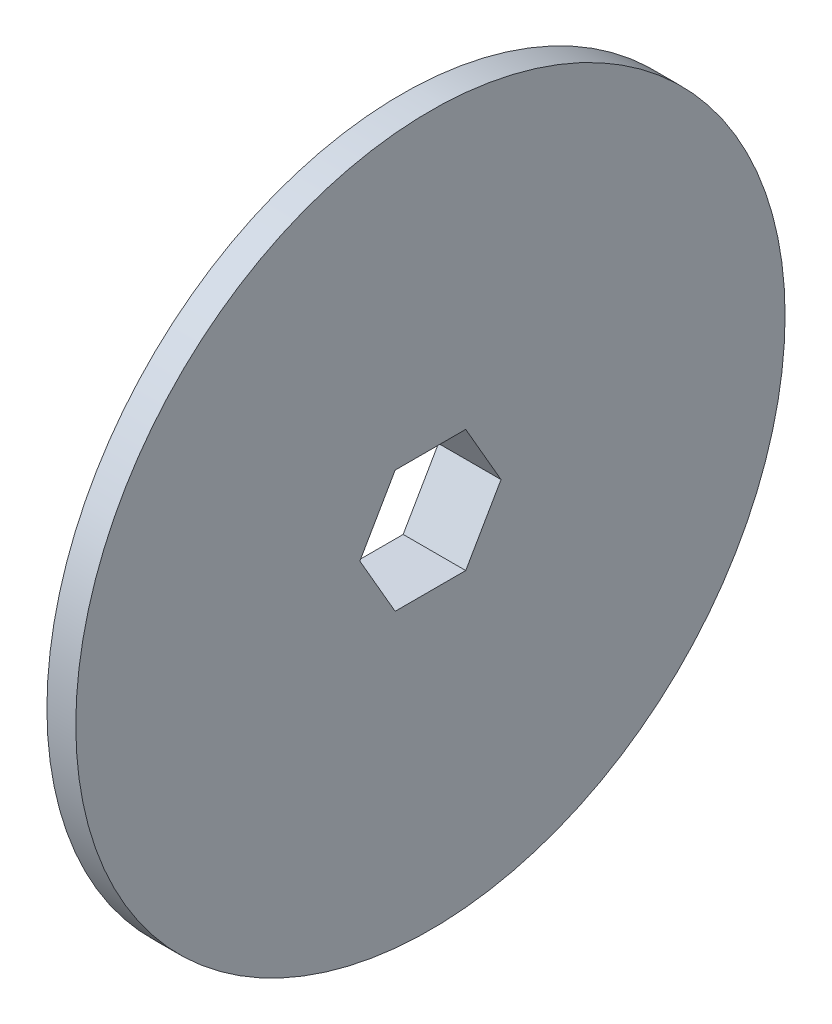
ISO-10303-21;
HEADER;
FILE_DESCRIPTION(('STEP AP214'),'2;1');
FILE_NAME('part.step','',(''),(''),'','','');
FILE_SCHEMA(('AUTOMOTIVE_DESIGN { 1 0 10303 214 1 1 1 1 }'));
ENDSEC;
DATA;
#1=APPLICATION_CONTEXT('core data for automotive mechanical design processes');
#2=APPLICATION_PROTOCOL_DEFINITION('international standard','automotive_design',2000,#1);
#3=PRODUCT_CONTEXT('',#1,'mechanical');
#4=PRODUCT('Part','Part','',(#3));
#5=PRODUCT_RELATED_PRODUCT_CATEGORY('part','',(#4));
#6=PRODUCT_DEFINITION_FORMATION('','',#4);
#7=PRODUCT_DEFINITION_CONTEXT('part definition',#1,'design');
#8=PRODUCT_DEFINITION('design','',#6,#7);
#9=PRODUCT_DEFINITION_SHAPE('','',#8);
#10=(LENGTH_UNIT() NAMED_UNIT(*) SI_UNIT(.MILLI.,.METRE.));
#11=(NAMED_UNIT(*) PLANE_ANGLE_UNIT() SI_UNIT($,.RADIAN.));
#12=(NAMED_UNIT(*) SI_UNIT($,.STERADIAN.) SOLID_ANGLE_UNIT());
#13=UNCERTAINTY_MEASURE_WITH_UNIT(LENGTH_MEASURE(1.E-05),#10,'distance_accuracy_value','');
#14=(GEOMETRIC_REPRESENTATION_CONTEXT(3) GLOBAL_UNCERTAINTY_ASSIGNED_CONTEXT((#13)) GLOBAL_UNIT_ASSIGNED_CONTEXT((#10,
#11,#12)) REPRESENTATION_CONTEXT('',''));
#15=CARTESIAN_POINT('',(0.,0.,0.));
#16=DIRECTION('',(0.,0.,1.));
#17=DIRECTION('',(1.,0.,0.));
#18=AXIS2_PLACEMENT_3D('',#15,#16,#17);
#19=CARTESIAN_POINT('',(0.,0.,0.));
#20=DIRECTION('',(1.,0.,0.));
#21=DIRECTION('',(0.,0.,-1.));
#22=AXIS2_PLACEMENT_3D('',#19,#20,#21);
#23=PLANE('',#22);
#24=CARTESIAN_POINT('',(0.,0.,0.));
#25=DIRECTION('',(1.,0.,0.));
#26=DIRECTION('',(0.,0.,-1.));
#27=AXIS2_PLACEMENT_3D('',#24,#25,#26);
#28=CIRCLE('',#27,14.345);
#29=CARTESIAN_POINT('',(0.,0.,-14.345));
#30=VERTEX_POINT('',#29);
#31=EDGE_CURVE('E51',#30,#30,#28,.T.);
#32=ORIENTED_EDGE('',*,*,#31,.F.);
#33=EDGE_LOOP('',(#32));
#34=FACE_BOUND('',#33,.T.);
#35=DIRECTION('',(0.,0.866025403784439,-0.5));
#36=VECTOR('',#35,1.);
#37=CARTESIAN_POINT('',(0.,-6.35,-3.66617420935412));
#38=LINE('',#37,#36);
#39=CARTESIAN_POINT('',(0.,-6.35,-3.66617420935412));
#40=VERTEX_POINT('',#39);
#41=CARTESIAN_POINT('',(0.,0.,-7.33234841870825));
#42=VERTEX_POINT('',#41);
#43=EDGE_CURVE('E63',#40,#42,#38,.T.);
#44=ORIENTED_EDGE('',*,*,#43,.T.);
#45=DIRECTION('',(0.,0.866025403784438,0.5));
#46=VECTOR('',#45,1.);
#47=CARTESIAN_POINT('',(0.,0.,-7.33234841870825));
#48=LINE('',#47,#46);
#49=CARTESIAN_POINT('',(0.,6.35,-3.66617420935412));
#50=VERTEX_POINT('',#49);
#51=EDGE_CURVE('E109',#42,#50,#48,.T.);
#52=ORIENTED_EDGE('',*,*,#51,.T.);
#53=DIRECTION('',(0.,0.,1.));
#54=VECTOR('',#53,1.);
#55=CARTESIAN_POINT('',(0.,6.35,-3.66617420935412));
#56=LINE('',#55,#54);
#57=CARTESIAN_POINT('',(0.,6.35,3.66617420935412));
#58=VERTEX_POINT('',#57);
#59=EDGE_CURVE('E153',#50,#58,#56,.T.);
#60=ORIENTED_EDGE('',*,*,#59,.T.);
#61=DIRECTION('',(0.,-0.866025403784439,0.5));
#62=VECTOR('',#61,1.);
#63=CARTESIAN_POINT('',(0.,6.35,3.66617420935412));
#64=LINE('',#63,#62);
#65=CARTESIAN_POINT('',(0.,0.,7.33234841870825));
#66=VERTEX_POINT('',#65);
#67=EDGE_CURVE('E157',#58,#66,#64,.T.);
#68=ORIENTED_EDGE('',*,*,#67,.T.);
#69=DIRECTION('',(0.,-0.866025403784438,-0.5));
#70=VECTOR('',#69,1.);
#71=CARTESIAN_POINT('',(0.,0.,7.33234841870825));
#72=LINE('',#71,#70);
#73=CARTESIAN_POINT('',(0.,-6.35,3.66617420935412));
#74=VERTEX_POINT('',#73);
#75=EDGE_CURVE('E161',#66,#74,#72,.T.);
#76=ORIENTED_EDGE('',*,*,#75,.T.);
#77=DIRECTION('',(0.,0.,-1.));
#78=VECTOR('',#77,1.);
#79=CARTESIAN_POINT('',(0.,-6.35,3.66617420935412));
#80=LINE('',#79,#78);
#81=EDGE_CURVE('E165',#74,#40,#80,.T.);
#82=ORIENTED_EDGE('',*,*,#81,.T.);
#83=EDGE_LOOP('',(#44,#52,#60,#68,#76,#82));
#84=FACE_BOUND('',#83,.T.);
#85=ADVANCED_FACE('F47',(#34,#84),#23,.F.);
#86=CARTESIAN_POINT('',(3.5,0.,0.));
#87=DIRECTION('',(-1.,0.,0.));
#88=DIRECTION('',(0.,0.,1.));
#89=AXIS2_PLACEMENT_3D('',#86,#87,#88);
#90=CYLINDRICAL_SURFACE('',#89,14.345);
#91=CARTESIAN_POINT('',(3.5,0.,0.));
#92=DIRECTION('',(1.,0.,0.));
#93=DIRECTION('',(0.,0.,-1.));
#94=AXIS2_PLACEMENT_3D('',#91,#92,#93);
#95=CIRCLE('',#94,14.345);
#96=CARTESIAN_POINT('',(3.5,0.,-14.345));
#97=VERTEX_POINT('',#96);
#98=EDGE_CURVE('E11',#97,#97,#95,.T.);
#99=ORIENTED_EDGE('',*,*,#98,.F.);
#100=EDGE_LOOP('',(#99));
#101=FACE_BOUND('',#100,.T.);
#102=ORIENTED_EDGE('',*,*,#31,.T.);
#103=EDGE_LOOP('',(#102));
#104=FACE_BOUND('',#103,.T.);
#105=ADVANCED_FACE('F49',(#101,#104),#90,.T.);
#106=CARTESIAN_POINT('',(3.5,-6.35,-3.66617420935412));
#107=DIRECTION('',(0.,0.5,0.866025403784439));
#108=DIRECTION('',(0.,-0.866025403784439,0.5));
#109=AXIS2_PLACEMENT_3D('',#106,#107,#108);
#110=PLANE('',#109);
#111=ORIENTED_EDGE('',*,*,#43,.F.);
#112=DIRECTION('',(-1.,0.,0.));
#113=VECTOR('',#112,1.);
#114=CARTESIAN_POINT('',(3.5,-6.35,-3.66617420935412));
#115=LINE('',#114,#113);
#116=CARTESIAN_POINT('',(6.5,-6.34999999999996,-3.6661742093542));
#117=VERTEX_POINT('',#116);
#118=EDGE_CURVE('E116',#117,#40,#115,.T.);
#119=ORIENTED_EDGE('',*,*,#118,.F.);
#120=DIRECTION('',(0.,0.866025403784441,-0.499999999999995));
#121=VECTOR('',#120,1.);
#122=CARTESIAN_POINT('',(6.5,-6.34999999999996,-3.6661742093542));
#123=LINE('',#122,#121);
#124=CARTESIAN_POINT('',(6.5,0.,-7.33234841870825));
#125=VERTEX_POINT('',#124);
#126=EDGE_CURVE('E114',#117,#125,#123,.T.);
#127=ORIENTED_EDGE('',*,*,#126,.T.);
#128=DIRECTION('',(-1.,0.,0.));
#129=VECTOR('',#128,1.);
#130=CARTESIAN_POINT('',(3.5,0.,-7.33234841870825));
#131=LINE('',#130,#129);
#132=EDGE_CURVE('E102',#125,#42,#131,.T.);
#133=ORIENTED_EDGE('',*,*,#132,.T.);
#134=EDGE_LOOP('',(#111,#119,#127,#133));
#135=FACE_BOUND('',#134,.T.);
#136=ADVANCED_FACE('F115',(#135),#110,.T.);
#137=CARTESIAN_POINT('',(3.5,0.,-7.33234841870825));
#138=DIRECTION('',(0.,-0.5,0.866025403784438));
#139=DIRECTION('',(0.,-0.866025403784439,-0.5));
#140=AXIS2_PLACEMENT_3D('',#137,#138,#139);
#141=PLANE('',#140);
#142=ORIENTED_EDGE('',*,*,#51,.F.);
#143=ORIENTED_EDGE('',*,*,#132,.F.);
#144=DIRECTION('',(0.,0.866025403784438,0.500000000000001));
#145=VECTOR('',#144,1.);
#146=CARTESIAN_POINT('',(6.5,0.,-7.33234841870825));
#147=LINE('',#146,#145);
#148=CARTESIAN_POINT('',(6.5,6.35000000000001,-3.66617420935411));
#149=VERTEX_POINT('',#148);
#150=EDGE_CURVE('E106',#125,#149,#147,.T.);
#151=ORIENTED_EDGE('',*,*,#150,.T.);
#152=DIRECTION('',(-1.,0.,0.));
#153=VECTOR('',#152,1.);
#154=CARTESIAN_POINT('',(3.5,6.35,-3.66617420935412));
#155=LINE('',#154,#153);
#156=EDGE_CURVE('E111',#149,#50,#155,.T.);
#157=ORIENTED_EDGE('',*,*,#156,.T.);
#158=EDGE_LOOP('',(#142,#143,#151,#157));
#159=FACE_BOUND('',#158,.T.);
#160=ADVANCED_FACE('F104',(#159),#141,.T.);
#161=CARTESIAN_POINT('',(3.5,6.35,-3.66617420935412));
#162=DIRECTION('',(0.,-1.,0.));
#163=DIRECTION('',(0.,0.,-1.));
#164=AXIS2_PLACEMENT_3D('',#161,#162,#163);
#165=PLANE('',#164);
#166=ORIENTED_EDGE('',*,*,#59,.F.);
#167=ORIENTED_EDGE('',*,*,#156,.F.);
#168=DIRECTION('',(0.,0.,1.));
#169=VECTOR('',#168,1.);
#170=CARTESIAN_POINT('',(6.5,6.35000000000001,-3.66617420935411));
#171=LINE('',#170,#169);
#172=CARTESIAN_POINT('',(6.5,6.34999999999999,3.66617420935415));
#173=VERTEX_POINT('',#172);
#174=EDGE_CURVE('E125',#149,#173,#171,.T.);
#175=ORIENTED_EDGE('',*,*,#174,.T.);
#176=DIRECTION('',(-1.,0.,0.));
#177=VECTOR('',#176,1.);
#178=CARTESIAN_POINT('',(3.5,6.35,3.66617420935412));
#179=LINE('',#178,#177);
#180=EDGE_CURVE('E176',#173,#58,#179,.T.);
#181=ORIENTED_EDGE('',*,*,#180,.T.);
#182=EDGE_LOOP('',(#166,#167,#175,#181));
#183=FACE_BOUND('',#182,.T.);
#184=ADVANCED_FACE('F182',(#183),#165,.T.);
#185=CARTESIAN_POINT('',(3.5,6.35,3.66617420935412));
#186=DIRECTION('',(0.,-0.5,-0.866025403784439));
#187=DIRECTION('',(0.,0.866025403784439,-0.5));
#188=AXIS2_PLACEMENT_3D('',#185,#186,#187);
#189=PLANE('',#188);
#190=ORIENTED_EDGE('',*,*,#67,.F.);
#191=ORIENTED_EDGE('',*,*,#180,.F.);
#192=DIRECTION('',(0.,-0.866025403784441,0.499999999999995));
#193=VECTOR('',#192,1.);
#194=CARTESIAN_POINT('',(6.5,6.34999999999999,3.66617420935415));
#195=LINE('',#194,#193);
#196=CARTESIAN_POINT('',(6.5,0.,7.33234841870825));
#197=VERTEX_POINT('',#196);
#198=EDGE_CURVE('E129',#173,#197,#195,.T.);
#199=ORIENTED_EDGE('',*,*,#198,.T.);
#200=DIRECTION('',(-1.,0.,0.));
#201=VECTOR('',#200,1.);
#202=CARTESIAN_POINT('',(3.5,0.,7.33234841870825));
#203=LINE('',#202,#201);
#204=EDGE_CURVE('E173',#197,#66,#203,.T.);
#205=ORIENTED_EDGE('',*,*,#204,.T.);
#206=EDGE_LOOP('',(#190,#191,#199,#205));
#207=FACE_BOUND('',#206,.T.);
#208=ADVANCED_FACE('F190',(#207),#189,.T.);
#209=CARTESIAN_POINT('',(3.5,0.,7.33234841870825));
#210=DIRECTION('',(0.,0.5,-0.866025403784438));
#211=DIRECTION('',(0.,0.866025403784439,0.5));
#212=AXIS2_PLACEMENT_3D('',#209,#210,#211);
#213=PLANE('',#212);
#214=ORIENTED_EDGE('',*,*,#75,.F.);
#215=ORIENTED_EDGE('',*,*,#204,.F.);
#216=DIRECTION('',(0.,-0.866025403784435,-0.500000000000007));
#217=VECTOR('',#216,1.);
#218=CARTESIAN_POINT('',(6.5,0.,7.33234841870825));
#219=LINE('',#218,#217);
#220=CARTESIAN_POINT('',(6.5,-6.35000000000004,3.66617420935407));
#221=VERTEX_POINT('',#220);
#222=EDGE_CURVE('E135',#197,#221,#219,.T.);
#223=ORIENTED_EDGE('',*,*,#222,.T.);
#224=DIRECTION('',(-1.,0.,0.));
#225=VECTOR('',#224,1.);
#226=CARTESIAN_POINT('',(3.5,-6.35,3.66617420935412));
#227=LINE('',#226,#225);
#228=EDGE_CURVE('E71',#221,#74,#227,.T.);
#229=ORIENTED_EDGE('',*,*,#228,.T.);
#230=EDGE_LOOP('',(#214,#215,#223,#229));
#231=FACE_BOUND('',#230,.T.);
#232=ADVANCED_FACE('F188',(#231),#213,.T.);
#233=CARTESIAN_POINT('',(3.5,-6.35,3.66617420935412));
#234=DIRECTION('',(0.,1.,0.));
#235=DIRECTION('',(0.,0.,1.));
#236=AXIS2_PLACEMENT_3D('',#233,#234,#235);
#237=PLANE('',#236);
#238=ORIENTED_EDGE('',*,*,#81,.F.);
#239=ORIENTED_EDGE('',*,*,#228,.F.);
#240=DIRECTION('',(0.,0.,-1.));
#241=VECTOR('',#240,1.);
#242=CARTESIAN_POINT('',(6.5,-6.35000000000004,3.66617420935407));
#243=LINE('',#242,#241);
#244=EDGE_CURVE('E138',#221,#117,#243,.T.);
#245=ORIENTED_EDGE('',*,*,#244,.T.);
#246=ORIENTED_EDGE('',*,*,#118,.T.);
#247=EDGE_LOOP('',(#238,#239,#245,#246));
#248=FACE_BOUND('',#247,.T.);
#249=ADVANCED_FACE('F186',(#248),#237,.T.);
#250=CARTESIAN_POINT('',(6.5,0.,0.));
#251=DIRECTION('',(1.,0.,0.));
#252=DIRECTION('',(0.,0.,-1.));
#253=AXIS2_PLACEMENT_3D('',#250,#251,#252);
#254=PLANE('',#253);
#255=CARTESIAN_POINT('',(6.5,0.,0.));
#256=DIRECTION('',(1.,0.,0.));
#257=DIRECTION('',(0.,0.,-1.));
#258=AXIS2_PLACEMENT_3D('',#255,#256,#257);
#259=CIRCLE('',#258,36.845);
#260=CARTESIAN_POINT('',(6.5,0.,-36.845));
#261=VERTEX_POINT('',#260);
#262=EDGE_CURVE('E142',#261,#261,#259,.T.);
#263=ORIENTED_EDGE('',*,*,#262,.T.);
#264=EDGE_LOOP('',(#263));
#265=FACE_BOUND('',#264,.T.);
#266=ORIENTED_EDGE('',*,*,#150,.F.);
#267=ORIENTED_EDGE('',*,*,#126,.F.);
#268=ORIENTED_EDGE('',*,*,#244,.F.);
#269=ORIENTED_EDGE('',*,*,#222,.F.);
#270=ORIENTED_EDGE('',*,*,#198,.F.);
#271=ORIENTED_EDGE('',*,*,#174,.F.);
#272=EDGE_LOOP('',(#266,#267,#268,#269,#270,#271));
#273=FACE_BOUND('',#272,.T.);
#274=ADVANCED_FACE('F122',(#265,#273),#254,.T.);
#275=CARTESIAN_POINT('',(3.5,0.,0.));
#276=DIRECTION('',(1.,0.,0.));
#277=DIRECTION('',(0.,0.,-1.));
#278=AXIS2_PLACEMENT_3D('',#275,#276,#277);
#279=PLANE('',#278);
#280=ORIENTED_EDGE('',*,*,#98,.T.);
#281=EDGE_LOOP('',(#280));
#282=FACE_BOUND('',#281,.T.);
#283=CARTESIAN_POINT('',(3.5,0.,0.));
#284=DIRECTION('',(1.,0.,0.));
#285=DIRECTION('',(0.,0.,-1.));
#286=AXIS2_PLACEMENT_3D('',#283,#284,#285);
#287=CIRCLE('',#286,36.845);
#288=CARTESIAN_POINT('',(3.5,0.,-36.845));
#289=VERTEX_POINT('',#288);
#290=EDGE_CURVE('E141',#289,#289,#287,.T.);
#291=ORIENTED_EDGE('',*,*,#290,.F.);
#292=EDGE_LOOP('',(#291));
#293=FACE_BOUND('',#292,.T.);
#294=ADVANCED_FACE('F255',(#282,#293),#279,.F.);
#295=CARTESIAN_POINT('',(6.5,0.,0.));
#296=DIRECTION('',(-1.,0.,0.));
#297=DIRECTION('',(0.,0.,1.));
#298=AXIS2_PLACEMENT_3D('',#295,#296,#297);
#299=CYLINDRICAL_SURFACE('',#298,36.845);
#300=ORIENTED_EDGE('',*,*,#262,.F.);
#301=EDGE_LOOP('',(#300));
#302=FACE_BOUND('',#301,.T.);
#303=ORIENTED_EDGE('',*,*,#290,.T.);
#304=EDGE_LOOP('',(#303));
#305=FACE_BOUND('',#304,.T.);
#306=ADVANCED_FACE('F265',(#302,#305),#299,.T.);
#307=CLOSED_SHELL('',(#85,#105,#136,#160,#184,#208,#232,#249,#274,#294,#306));
#308=MANIFOLD_SOLID_BREP('B2',#307);
#309=ADVANCED_BREP_SHAPE_REPRESENTATION('',(#18,#308),#14);
#310=SHAPE_DEFINITION_REPRESENTATION(#9,#309);
ENDSEC;
END-ISO-10303-21;
